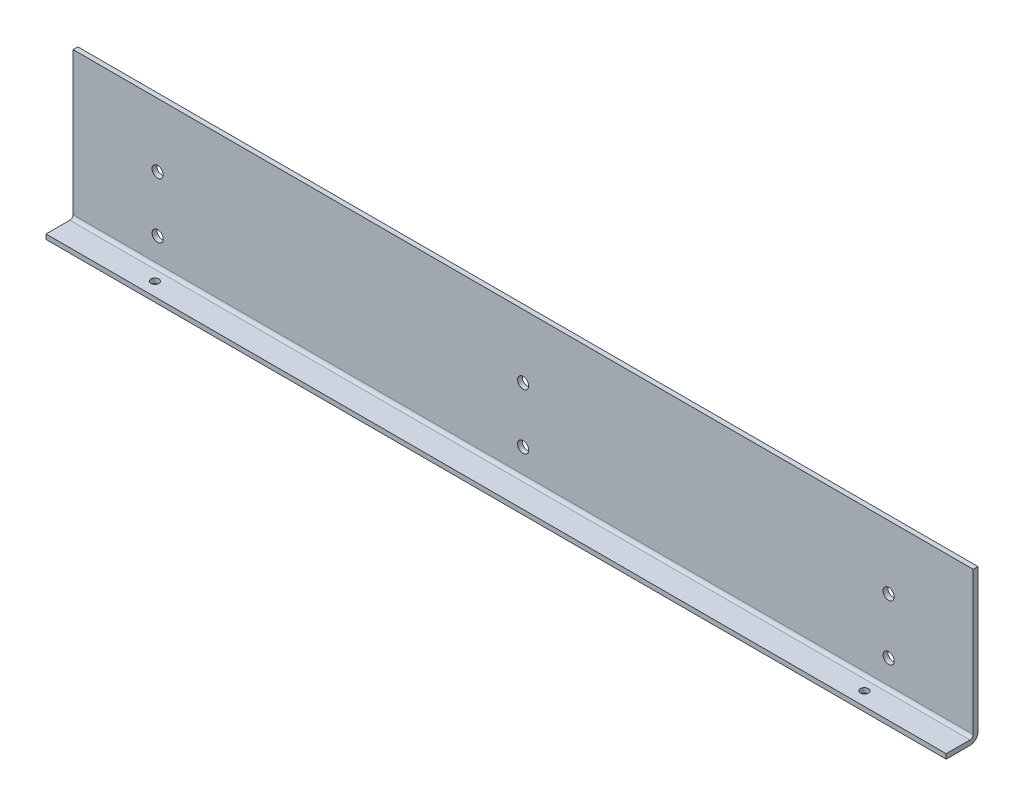
ISO-10303-21;
HEADER;
FILE_DESCRIPTION(('STEP AP214'),'2;1');
FILE_NAME('part.step','',(''),(''),'','','');
FILE_SCHEMA(('AUTOMOTIVE_DESIGN { 1 0 10303 214 1 1 1 1 }'));
ENDSEC;
DATA;
#1=APPLICATION_CONTEXT('core data for automotive mechanical design processes');
#2=APPLICATION_PROTOCOL_DEFINITION('international standard','automotive_design',2000,#1);
#3=PRODUCT_CONTEXT('',#1,'mechanical');
#4=PRODUCT('Part','Part','',(#3));
#5=PRODUCT_RELATED_PRODUCT_CATEGORY('part','',(#4));
#6=PRODUCT_DEFINITION_FORMATION('','',#4);
#7=PRODUCT_DEFINITION_CONTEXT('part definition',#1,'design');
#8=PRODUCT_DEFINITION('design','',#6,#7);
#9=PRODUCT_DEFINITION_SHAPE('','',#8);
#10=(LENGTH_UNIT() NAMED_UNIT(*) SI_UNIT(.MILLI.,.METRE.));
#11=(NAMED_UNIT(*) PLANE_ANGLE_UNIT() SI_UNIT($,.RADIAN.));
#12=(NAMED_UNIT(*) SI_UNIT($,.STERADIAN.) SOLID_ANGLE_UNIT());
#13=UNCERTAINTY_MEASURE_WITH_UNIT(LENGTH_MEASURE(1.E-05),#10,'distance_accuracy_value','');
#14=(GEOMETRIC_REPRESENTATION_CONTEXT(3) GLOBAL_UNCERTAINTY_ASSIGNED_CONTEXT((#13)) GLOBAL_UNIT_ASSIGNED_CONTEXT((#10,
#11,#12)) REPRESENTATION_CONTEXT('',''));
#15=CARTESIAN_POINT('',(0.,0.,0.));
#16=DIRECTION('',(0.,0.,1.));
#17=DIRECTION('',(1.,0.,0.));
#18=AXIS2_PLACEMENT_3D('',#15,#16,#17);
#19=CARTESIAN_POINT('',(0.,0.,3.));
#20=DIRECTION('',(0.,0.,-1.));
#21=DIRECTION('',(-1.,0.,0.));
#22=AXIS2_PLACEMENT_3D('',#19,#20,#21);
#23=PLANE('',#22);
#24=CARTESIAN_POINT('',(513.25,55.,3.));
#25=DIRECTION('',(0.,0.,1.));
#26=DIRECTION('',(1.,0.,0.));
#27=AXIS2_PLACEMENT_3D('',#24,#25,#26);
#28=CIRCLE('',#27,3.50000000000008);
#29=CARTESIAN_POINT('',(516.75,55.,3.));
#30=VERTEX_POINT('',#29);
#31=EDGE_CURVE('E289',#30,#30,#28,.T.);
#32=ORIENTED_EDGE('',*,*,#31,.F.);
#33=EDGE_LOOP('',(#32));
#34=FACE_BOUND('',#33,.T.);
#35=CARTESIAN_POINT('',(283.25,20.,3.));
#36=DIRECTION('',(0.,0.,1.));
#37=DIRECTION('',(1.,0.,0.));
#38=AXIS2_PLACEMENT_3D('',#35,#36,#37);
#39=CIRCLE('',#38,3.50000000000002);
#40=CARTESIAN_POINT('',(286.75,20.,3.));
#41=VERTEX_POINT('',#40);
#42=EDGE_CURVE('E280',#41,#41,#39,.T.);
#43=ORIENTED_EDGE('',*,*,#42,.F.);
#44=EDGE_LOOP('',(#43));
#45=FACE_BOUND('',#44,.T.);
#46=CARTESIAN_POINT('',(283.25,55.,3.));
#47=DIRECTION('',(0.,0.,1.));
#48=DIRECTION('',(1.,0.,0.));
#49=AXIS2_PLACEMENT_3D('',#46,#47,#48);
#50=CIRCLE('',#49,3.50000000000002);
#51=CARTESIAN_POINT('',(286.75,55.,3.));
#52=VERTEX_POINT('',#51);
#53=EDGE_CURVE('E304',#52,#52,#50,.T.);
#54=ORIENTED_EDGE('',*,*,#53,.F.);
#55=EDGE_LOOP('',(#54));
#56=FACE_BOUND('',#55,.T.);
#57=CARTESIAN_POINT('',(53.25,20.,3.));
#58=DIRECTION('',(0.,0.,1.));
#59=DIRECTION('',(1.,0.,0.));
#60=AXIS2_PLACEMENT_3D('',#57,#58,#59);
#61=CIRCLE('',#60,3.50000000000001);
#62=CARTESIAN_POINT('',(56.75,20.,3.));
#63=VERTEX_POINT('',#62);
#64=EDGE_CURVE('E296',#63,#63,#61,.T.);
#65=ORIENTED_EDGE('',*,*,#64,.F.);
#66=EDGE_LOOP('',(#65));
#67=FACE_BOUND('',#66,.T.);
#68=CARTESIAN_POINT('',(513.25,20.,3.));
#69=DIRECTION('',(0.,0.,1.));
#70=DIRECTION('',(1.,0.,0.));
#71=AXIS2_PLACEMENT_3D('',#68,#69,#70);
#72=CIRCLE('',#71,3.50000000000008);
#73=CARTESIAN_POINT('',(516.75,20.,3.));
#74=VERTEX_POINT('',#73);
#75=EDGE_CURVE('E271',#74,#74,#72,.T.);
#76=ORIENTED_EDGE('',*,*,#75,.F.);
#77=EDGE_LOOP('',(#76));
#78=FACE_BOUND('',#77,.T.);
#79=CARTESIAN_POINT('',(53.25,55.,3.));
#80=DIRECTION('',(0.,0.,1.));
#81=DIRECTION('',(1.,0.,0.));
#82=AXIS2_PLACEMENT_3D('',#79,#80,#81);
#83=CIRCLE('',#82,3.50000000000001);
#84=CARTESIAN_POINT('',(56.75,55.,3.));
#85=VERTEX_POINT('',#84);
#86=EDGE_CURVE('E142',#85,#85,#83,.T.);
#87=ORIENTED_EDGE('',*,*,#86,.F.);
#88=EDGE_LOOP('',(#87));
#89=FACE_BOUND('',#88,.T.);
#90=DIRECTION('',(0.,-1.,0.));
#91=VECTOR('',#90,1.);
#92=CARTESIAN_POINT('',(0.,0.,3.));
#93=LINE('',#92,#91);
#94=CARTESIAN_POINT('',(0.,95.,3.));
#95=VERTEX_POINT('',#94);
#96=CARTESIAN_POINT('',(0.,5.,3.));
#97=VERTEX_POINT('',#96);
#98=EDGE_CURVE('E158',#95,#97,#93,.T.);
#99=ORIENTED_EDGE('',*,*,#98,.T.);
#100=DIRECTION('',(-1.,0.,0.));
#101=VECTOR('',#100,1.);
#102=CARTESIAN_POINT('',(566.5,5.,3.));
#103=LINE('',#102,#101);
#104=CARTESIAN_POINT('',(566.5,5.,3.));
#105=VERTEX_POINT('',#104);
#106=EDGE_CURVE('E67',#97,#105,#103,.F.);
#107=ORIENTED_EDGE('',*,*,#106,.T.);
#108=DIRECTION('',(0.,1.,0.));
#109=VECTOR('',#108,1.);
#110=CARTESIAN_POINT('',(566.5,0.,3.));
#111=LINE('',#110,#109);
#112=CARTESIAN_POINT('',(566.5,95.,3.));
#113=VERTEX_POINT('',#112);
#114=EDGE_CURVE('E161',#105,#113,#111,.T.);
#115=ORIENTED_EDGE('',*,*,#114,.T.);
#116=DIRECTION('',(-1.,0.,0.));
#117=VECTOR('',#116,1.);
#118=CARTESIAN_POINT('',(0.,95.,3.));
#119=LINE('',#118,#117);
#120=EDGE_CURVE('E165',#113,#95,#119,.T.);
#121=ORIENTED_EDGE('',*,*,#120,.T.);
#122=EDGE_LOOP('',(#99,#107,#115,#121));
#123=FACE_BOUND('',#122,.T.);
#124=ADVANCED_FACE('F45',(#34,#45,#56,#67,#78,#89,#123),#23,.F.);
#125=CARTESIAN_POINT('',(0.,0.,3.));
#126=DIRECTION('',(1.,0.,0.));
#127=DIRECTION('',(0.,0.,-1.));
#128=AXIS2_PLACEMENT_3D('',#125,#126,#127);
#129=PLANE('',#128);
#130=DIRECTION('',(0.,-1.,0.));
#131=VECTOR('',#130,1.);
#132=CARTESIAN_POINT('',(0.,0.,0.));
#133=LINE('',#132,#131);
#134=CARTESIAN_POINT('',(0.,95.,0.));
#135=VERTEX_POINT('',#134);
#136=CARTESIAN_POINT('',(0.,5.,0.));
#137=VERTEX_POINT('',#136);
#138=EDGE_CURVE('E157',#135,#137,#133,.T.);
#139=ORIENTED_EDGE('',*,*,#138,.T.);
#140=CARTESIAN_POINT('',(0.,5.,5.));
#141=DIRECTION('',(1.,0.,0.));
#142=DIRECTION('',(0.,0.,-1.));
#143=AXIS2_PLACEMENT_3D('',#140,#141,#142);
#144=CIRCLE('',#143,5.);
#145=CARTESIAN_POINT('',(0.,0.,5.));
#146=VERTEX_POINT('',#145);
#147=EDGE_CURVE('E116',#137,#146,#144,.F.);
#148=ORIENTED_EDGE('',*,*,#147,.T.);
#149=DIRECTION('',(0.,0.,-1.));
#150=VECTOR('',#149,1.);
#151=CARTESIAN_POINT('',(0.,0.,3.));
#152=LINE('',#151,#150);
#153=CARTESIAN_POINT('',(0.,0.,20.));
#154=VERTEX_POINT('',#153);
#155=EDGE_CURVE('E109',#154,#146,#152,.T.);
#156=ORIENTED_EDGE('',*,*,#155,.F.);
#157=DIRECTION('',(0.,-1.,0.));
#158=VECTOR('',#157,1.);
#159=CARTESIAN_POINT('',(0.,0.,20.));
#160=LINE('',#159,#158);
#161=CARTESIAN_POINT('',(0.,3.,20.));
#162=VERTEX_POINT('',#161);
#163=EDGE_CURVE('E114',#162,#154,#160,.T.);
#164=ORIENTED_EDGE('',*,*,#163,.F.);
#165=DIRECTION('',(0.,0.,-1.));
#166=VECTOR('',#165,1.);
#167=CARTESIAN_POINT('',(0.,3.,20.));
#168=LINE('',#167,#166);
#169=CARTESIAN_POINT('',(0.,3.,5.));
#170=VERTEX_POINT('',#169);
#171=EDGE_CURVE('E150',#162,#170,#168,.T.);
#172=ORIENTED_EDGE('',*,*,#171,.T.);
#173=CARTESIAN_POINT('',(0.,5.,5.));
#174=DIRECTION('',(1.,0.,0.));
#175=DIRECTION('',(0.,0.,-1.));
#176=AXIS2_PLACEMENT_3D('',#173,#174,#175);
#177=CIRCLE('',#176,2.);
#178=EDGE_CURVE('E54',#170,#97,#177,.T.);
#179=ORIENTED_EDGE('',*,*,#178,.T.);
#180=ORIENTED_EDGE('',*,*,#98,.F.);
#181=DIRECTION('',(0.,0.,-1.));
#182=VECTOR('',#181,1.);
#183=CARTESIAN_POINT('',(0.,95.,3.));
#184=LINE('',#183,#182);
#185=EDGE_CURVE('E168',#95,#135,#184,.T.);
#186=ORIENTED_EDGE('',*,*,#185,.T.);
#187=EDGE_LOOP('',(#139,#148,#156,#164,#172,#179,#180,#186));
#188=FACE_BOUND('',#187,.T.);
#189=ADVANCED_FACE('F112',(#188),#129,.F.);
#190=CARTESIAN_POINT('',(0.,0.,3.));
#191=DIRECTION('',(0.,1.,0.));
#192=DIRECTION('',(0.,0.,1.));
#193=AXIS2_PLACEMENT_3D('',#190,#191,#192);
#194=PLANE('',#193);
#195=CARTESIAN_POINT('',(60.0000000000001,0.,11.5));
#196=DIRECTION('',(0.,1.,0.));
#197=DIRECTION('',(0.,0.,1.));
#198=AXIS2_PLACEMENT_3D('',#195,#196,#197);
#199=CIRCLE('',#198,2.5);
#200=CARTESIAN_POINT('',(60.0000000000001,0.,14.));
#201=VERTEX_POINT('',#200);
#202=EDGE_CURVE('E257',#201,#201,#199,.T.);
#203=ORIENTED_EDGE('',*,*,#202,.T.);
#204=EDGE_LOOP('',(#203));
#205=FACE_BOUND('',#204,.T.);
#206=CARTESIAN_POINT('',(506.5,0.,11.5));
#207=DIRECTION('',(0.,1.,0.));
#208=DIRECTION('',(0.,0.,1.));
#209=AXIS2_PLACEMENT_3D('',#206,#207,#208);
#210=CIRCLE('',#209,2.50000000000003);
#211=CARTESIAN_POINT('',(506.5,0.,14.));
#212=VERTEX_POINT('',#211);
#213=EDGE_CURVE('E260',#212,#212,#210,.T.);
#214=ORIENTED_EDGE('',*,*,#213,.T.);
#215=EDGE_LOOP('',(#214));
#216=FACE_BOUND('',#215,.T.);
#217=ORIENTED_EDGE('',*,*,#155,.T.);
#218=DIRECTION('',(1.,0.,0.));
#219=VECTOR('',#218,1.);
#220=CARTESIAN_POINT('',(566.5,0.,5.));
#221=LINE('',#220,#219);
#222=CARTESIAN_POINT('',(566.5,0.,5.));
#223=VERTEX_POINT('',#222);
#224=EDGE_CURVE('E121',#146,#223,#221,.T.);
#225=ORIENTED_EDGE('',*,*,#224,.T.);
#226=DIRECTION('',(0.,0.,-1.));
#227=VECTOR('',#226,1.);
#228=CARTESIAN_POINT('',(566.5,0.,3.));
#229=LINE('',#228,#227);
#230=CARTESIAN_POINT('',(566.5,0.,20.));
#231=VERTEX_POINT('',#230);
#232=EDGE_CURVE('E122',#231,#223,#229,.T.);
#233=ORIENTED_EDGE('',*,*,#232,.F.);
#234=DIRECTION('',(1.,0.,0.));
#235=VECTOR('',#234,1.);
#236=CARTESIAN_POINT('',(0.,0.,20.));
#237=LINE('',#236,#235);
#238=EDGE_CURVE('E125',#154,#231,#237,.T.);
#239=ORIENTED_EDGE('',*,*,#238,.F.);
#240=EDGE_LOOP('',(#217,#225,#233,#239));
#241=FACE_BOUND('',#240,.T.);
#242=ADVANCED_FACE('F126',(#205,#216,#241),#194,.F.);
#243=CARTESIAN_POINT('',(566.5,0.,3.));
#244=DIRECTION('',(-1.,0.,0.));
#245=DIRECTION('',(0.,0.,1.));
#246=AXIS2_PLACEMENT_3D('',#243,#244,#245);
#247=PLANE('',#246);
#248=ORIENTED_EDGE('',*,*,#232,.T.);
#249=CARTESIAN_POINT('',(566.5,5.,5.));
#250=DIRECTION('',(-1.,0.,0.));
#251=DIRECTION('',(0.,0.,1.));
#252=AXIS2_PLACEMENT_3D('',#249,#250,#251);
#253=CIRCLE('',#252,5.);
#254=CARTESIAN_POINT('',(566.5,5.,0.));
#255=VERTEX_POINT('',#254);
#256=EDGE_CURVE('E187',#223,#255,#253,.F.);
#257=ORIENTED_EDGE('',*,*,#256,.T.);
#258=DIRECTION('',(0.,1.,0.));
#259=VECTOR('',#258,1.);
#260=CARTESIAN_POINT('',(566.5,0.,0.));
#261=LINE('',#260,#259);
#262=CARTESIAN_POINT('',(566.5,95.,0.));
#263=VERTEX_POINT('',#262);
#264=EDGE_CURVE('E171',#255,#263,#261,.T.);
#265=ORIENTED_EDGE('',*,*,#264,.T.);
#266=DIRECTION('',(0.,0.,-1.));
#267=VECTOR('',#266,1.);
#268=CARTESIAN_POINT('',(566.5,95.,3.));
#269=LINE('',#268,#267);
#270=EDGE_CURVE('E179',#113,#263,#269,.T.);
#271=ORIENTED_EDGE('',*,*,#270,.F.);
#272=ORIENTED_EDGE('',*,*,#114,.F.);
#273=CARTESIAN_POINT('',(566.5,5.,5.));
#274=DIRECTION('',(-1.,0.,0.));
#275=DIRECTION('',(0.,0.,1.));
#276=AXIS2_PLACEMENT_3D('',#273,#274,#275);
#277=CIRCLE('',#276,2.);
#278=CARTESIAN_POINT('',(566.5,3.,5.));
#279=VERTEX_POINT('',#278);
#280=EDGE_CURVE('E11',#105,#279,#277,.T.);
#281=ORIENTED_EDGE('',*,*,#280,.T.);
#282=DIRECTION('',(0.,0.,-1.));
#283=VECTOR('',#282,1.);
#284=CARTESIAN_POINT('',(566.5,3.,20.));
#285=LINE('',#284,#283);
#286=CARTESIAN_POINT('',(566.5,3.,20.));
#287=VERTEX_POINT('',#286);
#288=EDGE_CURVE('E153',#287,#279,#285,.T.);
#289=ORIENTED_EDGE('',*,*,#288,.F.);
#290=DIRECTION('',(0.,1.,0.));
#291=VECTOR('',#290,1.);
#292=CARTESIAN_POINT('',(566.5,0.,20.));
#293=LINE('',#292,#291);
#294=EDGE_CURVE('E131',#231,#287,#293,.T.);
#295=ORIENTED_EDGE('',*,*,#294,.F.);
#296=EDGE_LOOP('',(#248,#257,#265,#271,#272,#281,#289,#295));
#297=FACE_BOUND('',#296,.T.);
#298=ADVANCED_FACE('F208',(#297),#247,.F.);
#299=CARTESIAN_POINT('',(0.,95.,3.));
#300=DIRECTION('',(0.,-1.,0.));
#301=DIRECTION('',(0.,0.,-1.));
#302=AXIS2_PLACEMENT_3D('',#299,#300,#301);
#303=PLANE('',#302);
#304=DIRECTION('',(-1.,0.,0.));
#305=VECTOR('',#304,1.);
#306=CARTESIAN_POINT('',(0.,95.,0.));
#307=LINE('',#306,#305);
#308=EDGE_CURVE('E162',#263,#135,#307,.T.);
#309=ORIENTED_EDGE('',*,*,#308,.T.);
#310=ORIENTED_EDGE('',*,*,#185,.F.);
#311=ORIENTED_EDGE('',*,*,#120,.F.);
#312=ORIENTED_EDGE('',*,*,#270,.T.);
#313=EDGE_LOOP('',(#309,#310,#311,#312));
#314=FACE_BOUND('',#313,.T.);
#315=ADVANCED_FACE('F213',(#314),#303,.F.);
#316=CARTESIAN_POINT('',(0.,0.,0.));
#317=DIRECTION('',(0.,0.,-1.));
#318=DIRECTION('',(-1.,0.,0.));
#319=AXIS2_PLACEMENT_3D('',#316,#317,#318);
#320=PLANE('',#319);
#321=CARTESIAN_POINT('',(513.25,55.,0.));
#322=DIRECTION('',(0.,0.,1.));
#323=DIRECTION('',(1.,0.,0.));
#324=AXIS2_PLACEMENT_3D('',#321,#322,#323);
#325=CIRCLE('',#324,3.50000000000008);
#326=CARTESIAN_POINT('',(516.75,55.,0.));
#327=VERTEX_POINT('',#326);
#328=EDGE_CURVE('E275',#327,#327,#325,.T.);
#329=ORIENTED_EDGE('',*,*,#328,.T.);
#330=EDGE_LOOP('',(#329));
#331=FACE_BOUND('',#330,.T.);
#332=CARTESIAN_POINT('',(283.25,20.,0.));
#333=DIRECTION('',(0.,0.,1.));
#334=DIRECTION('',(1.,0.,0.));
#335=AXIS2_PLACEMENT_3D('',#332,#333,#334);
#336=CIRCLE('',#335,3.50000000000002);
#337=CARTESIAN_POINT('',(286.75,20.,0.));
#338=VERTEX_POINT('',#337);
#339=EDGE_CURVE('E285',#338,#338,#336,.T.);
#340=ORIENTED_EDGE('',*,*,#339,.T.);
#341=EDGE_LOOP('',(#340));
#342=FACE_BOUND('',#341,.T.);
#343=CARTESIAN_POINT('',(283.25,55.,0.));
#344=DIRECTION('',(0.,0.,1.));
#345=DIRECTION('',(1.,0.,0.));
#346=AXIS2_PLACEMENT_3D('',#343,#344,#345);
#347=CIRCLE('',#346,3.50000000000002);
#348=CARTESIAN_POINT('',(286.75,55.,0.));
#349=VERTEX_POINT('',#348);
#350=EDGE_CURVE('E284',#349,#349,#347,.T.);
#351=ORIENTED_EDGE('',*,*,#350,.T.);
#352=EDGE_LOOP('',(#351));
#353=FACE_BOUND('',#352,.T.);
#354=CARTESIAN_POINT('',(53.25,20.,0.));
#355=DIRECTION('',(0.,0.,1.));
#356=DIRECTION('',(1.,0.,0.));
#357=AXIS2_PLACEMENT_3D('',#354,#355,#356);
#358=CIRCLE('',#357,3.50000000000001);
#359=CARTESIAN_POINT('',(56.75,20.,0.));
#360=VERTEX_POINT('',#359);
#361=EDGE_CURVE('E300',#360,#360,#358,.T.);
#362=ORIENTED_EDGE('',*,*,#361,.T.);
#363=EDGE_LOOP('',(#362));
#364=FACE_BOUND('',#363,.T.);
#365=CARTESIAN_POINT('',(513.25,20.,0.));
#366=DIRECTION('',(0.,0.,1.));
#367=DIRECTION('',(1.,0.,0.));
#368=AXIS2_PLACEMENT_3D('',#365,#366,#367);
#369=CIRCLE('',#368,3.50000000000008);
#370=CARTESIAN_POINT('',(516.75,20.,0.));
#371=VERTEX_POINT('',#370);
#372=EDGE_CURVE('E276',#371,#371,#369,.T.);
#373=ORIENTED_EDGE('',*,*,#372,.T.);
#374=EDGE_LOOP('',(#373));
#375=FACE_BOUND('',#374,.T.);
#376=CARTESIAN_POINT('',(53.25,55.,0.));
#377=DIRECTION('',(0.,0.,1.));
#378=DIRECTION('',(1.,0.,0.));
#379=AXIS2_PLACEMENT_3D('',#376,#377,#378);
#380=CIRCLE('',#379,3.50000000000001);
#381=CARTESIAN_POINT('',(56.75,55.,0.));
#382=VERTEX_POINT('',#381);
#383=EDGE_CURVE('E138',#382,#382,#380,.T.);
#384=ORIENTED_EDGE('',*,*,#383,.T.);
#385=EDGE_LOOP('',(#384));
#386=FACE_BOUND('',#385,.T.);
#387=ORIENTED_EDGE('',*,*,#264,.F.);
#388=DIRECTION('',(1.,0.,0.));
#389=VECTOR('',#388,1.);
#390=CARTESIAN_POINT('',(0.,5.,0.));
#391=LINE('',#390,#389);
#392=EDGE_CURVE('E190',#255,#137,#391,.F.);
#393=ORIENTED_EDGE('',*,*,#392,.T.);
#394=ORIENTED_EDGE('',*,*,#138,.F.);
#395=ORIENTED_EDGE('',*,*,#308,.F.);
#396=EDGE_LOOP('',(#387,#393,#394,#395));
#397=FACE_BOUND('',#396,.T.);
#398=ADVANCED_FACE('F218',(#331,#342,#353,#364,#375,#386,#397),#320,.T.);
#399=CARTESIAN_POINT('',(0.,3.,20.));
#400=DIRECTION('',(0.,-1.,0.));
#401=DIRECTION('',(0.,0.,-1.));
#402=AXIS2_PLACEMENT_3D('',#399,#400,#401);
#403=PLANE('',#402);
#404=CARTESIAN_POINT('',(60.0000000000001,3.,11.5));
#405=DIRECTION('',(0.,1.,0.));
#406=DIRECTION('',(0.,0.,1.));
#407=AXIS2_PLACEMENT_3D('',#404,#405,#406);
#408=CIRCLE('',#407,2.5);
#409=CARTESIAN_POINT('',(60.0000000000001,3.,14.));
#410=VERTEX_POINT('',#409);
#411=EDGE_CURVE('E267',#410,#410,#408,.T.);
#412=ORIENTED_EDGE('',*,*,#411,.F.);
#413=EDGE_LOOP('',(#412));
#414=FACE_BOUND('',#413,.T.);
#415=CARTESIAN_POINT('',(506.5,3.,11.5));
#416=DIRECTION('',(0.,1.,0.));
#417=DIRECTION('',(0.,0.,1.));
#418=AXIS2_PLACEMENT_3D('',#415,#416,#417);
#419=CIRCLE('',#418,2.50000000000003);
#420=CARTESIAN_POINT('',(506.5,3.,14.));
#421=VERTEX_POINT('',#420);
#422=EDGE_CURVE('E263',#421,#421,#419,.T.);
#423=ORIENTED_EDGE('',*,*,#422,.F.);
#424=EDGE_LOOP('',(#423));
#425=FACE_BOUND('',#424,.T.);
#426=ORIENTED_EDGE('',*,*,#288,.T.);
#427=DIRECTION('',(-1.,0.,0.));
#428=VECTOR('',#427,1.);
#429=CARTESIAN_POINT('',(0.,3.,5.));
#430=LINE('',#429,#428);
#431=EDGE_CURVE('E195',#279,#170,#430,.T.);
#432=ORIENTED_EDGE('',*,*,#431,.T.);
#433=ORIENTED_EDGE('',*,*,#171,.F.);
#434=DIRECTION('',(-1.,0.,0.));
#435=VECTOR('',#434,1.);
#436=CARTESIAN_POINT('',(0.,3.,20.));
#437=LINE('',#436,#435);
#438=EDGE_CURVE('E135',#287,#162,#437,.T.);
#439=ORIENTED_EDGE('',*,*,#438,.F.);
#440=EDGE_LOOP('',(#426,#432,#433,#439));
#441=FACE_BOUND('',#440,.T.);
#442=ADVANCED_FACE('F203',(#414,#425,#441),#403,.F.);
#443=CARTESIAN_POINT('',(0.,0.,20.));
#444=DIRECTION('',(0.,0.,-1.));
#445=DIRECTION('',(-1.,0.,0.));
#446=AXIS2_PLACEMENT_3D('',#443,#444,#445);
#447=PLANE('',#446);
#448=ORIENTED_EDGE('',*,*,#163,.T.);
#449=ORIENTED_EDGE('',*,*,#238,.T.);
#450=ORIENTED_EDGE('',*,*,#294,.T.);
#451=ORIENTED_EDGE('',*,*,#438,.T.);
#452=EDGE_LOOP('',(#448,#449,#450,#451));
#453=FACE_BOUND('',#452,.T.);
#454=ADVANCED_FACE('F133',(#453),#447,.F.);
#455=CARTESIAN_POINT('',(53.25,55.,0.));
#456=DIRECTION('',(0.,0.,1.));
#457=DIRECTION('',(1.,0.,0.));
#458=AXIS2_PLACEMENT_3D('',#455,#456,#457);
#459=CYLINDRICAL_SURFACE('',#458,3.50000000000001);
#460=ORIENTED_EDGE('',*,*,#383,.F.);
#461=EDGE_LOOP('',(#460));
#462=FACE_BOUND('',#461,.T.);
#463=ORIENTED_EDGE('',*,*,#86,.T.);
#464=EDGE_LOOP('',(#463));
#465=FACE_BOUND('',#464,.T.);
#466=ADVANCED_FACE('F331',(#462,#465),#459,.F.);
#467=CARTESIAN_POINT('',(513.25,20.,0.));
#468=DIRECTION('',(0.,0.,1.));
#469=DIRECTION('',(1.,0.,0.));
#470=AXIS2_PLACEMENT_3D('',#467,#468,#469);
#471=CYLINDRICAL_SURFACE('',#470,3.50000000000008);
#472=ORIENTED_EDGE('',*,*,#372,.F.);
#473=EDGE_LOOP('',(#472));
#474=FACE_BOUND('',#473,.T.);
#475=ORIENTED_EDGE('',*,*,#75,.T.);
#476=EDGE_LOOP('',(#475));
#477=FACE_BOUND('',#476,.T.);
#478=ADVANCED_FACE('F333',(#474,#477),#471,.F.);
#479=CARTESIAN_POINT('',(53.25,20.,0.));
#480=DIRECTION('',(0.,0.,1.));
#481=DIRECTION('',(1.,0.,0.));
#482=AXIS2_PLACEMENT_3D('',#479,#480,#481);
#483=CYLINDRICAL_SURFACE('',#482,3.50000000000001);
#484=ORIENTED_EDGE('',*,*,#361,.F.);
#485=EDGE_LOOP('',(#484));
#486=FACE_BOUND('',#485,.T.);
#487=ORIENTED_EDGE('',*,*,#64,.T.);
#488=EDGE_LOOP('',(#487));
#489=FACE_BOUND('',#488,.T.);
#490=ADVANCED_FACE('F318',(#486,#489),#483,.F.);
#491=CARTESIAN_POINT('',(283.25,55.,0.));
#492=DIRECTION('',(0.,0.,1.));
#493=DIRECTION('',(1.,0.,0.));
#494=AXIS2_PLACEMENT_3D('',#491,#492,#493);
#495=CYLINDRICAL_SURFACE('',#494,3.50000000000002);
#496=ORIENTED_EDGE('',*,*,#350,.F.);
#497=EDGE_LOOP('',(#496));
#498=FACE_BOUND('',#497,.T.);
#499=ORIENTED_EDGE('',*,*,#53,.T.);
#500=EDGE_LOOP('',(#499));
#501=FACE_BOUND('',#500,.T.);
#502=ADVANCED_FACE('F314',(#498,#501),#495,.F.);
#503=CARTESIAN_POINT('',(283.25,20.,0.));
#504=DIRECTION('',(0.,0.,1.));
#505=DIRECTION('',(1.,0.,0.));
#506=AXIS2_PLACEMENT_3D('',#503,#504,#505);
#507=CYLINDRICAL_SURFACE('',#506,3.50000000000002);
#508=ORIENTED_EDGE('',*,*,#339,.F.);
#509=EDGE_LOOP('',(#508));
#510=FACE_BOUND('',#509,.T.);
#511=ORIENTED_EDGE('',*,*,#42,.T.);
#512=EDGE_LOOP('',(#511));
#513=FACE_BOUND('',#512,.T.);
#514=ADVANCED_FACE('F317',(#510,#513),#507,.F.);
#515=CARTESIAN_POINT('',(513.25,55.,0.));
#516=DIRECTION('',(0.,0.,1.));
#517=DIRECTION('',(1.,0.,0.));
#518=AXIS2_PLACEMENT_3D('',#515,#516,#517);
#519=CYLINDRICAL_SURFACE('',#518,3.50000000000008);
#520=ORIENTED_EDGE('',*,*,#328,.F.);
#521=EDGE_LOOP('',(#520));
#522=FACE_BOUND('',#521,.T.);
#523=ORIENTED_EDGE('',*,*,#31,.T.);
#524=EDGE_LOOP('',(#523));
#525=FACE_BOUND('',#524,.T.);
#526=ADVANCED_FACE('F347',(#522,#525),#519,.F.);
#527=CARTESIAN_POINT('',(506.5,0.,11.5));
#528=DIRECTION('',(0.,1.,0.));
#529=DIRECTION('',(0.,0.,1.));
#530=AXIS2_PLACEMENT_3D('',#527,#528,#529);
#531=CYLINDRICAL_SURFACE('',#530,2.50000000000003);
#532=ORIENTED_EDGE('',*,*,#213,.F.);
#533=EDGE_LOOP('',(#532));
#534=FACE_BOUND('',#533,.T.);
#535=ORIENTED_EDGE('',*,*,#422,.T.);
#536=EDGE_LOOP('',(#535));
#537=FACE_BOUND('',#536,.T.);
#538=ADVANCED_FACE('F230',(#534,#537),#531,.F.);
#539=CARTESIAN_POINT('',(60.0000000000001,0.,11.5));
#540=DIRECTION('',(0.,1.,0.));
#541=DIRECTION('',(0.,0.,1.));
#542=AXIS2_PLACEMENT_3D('',#539,#540,#541);
#543=CYLINDRICAL_SURFACE('',#542,2.5);
#544=ORIENTED_EDGE('',*,*,#202,.F.);
#545=EDGE_LOOP('',(#544));
#546=FACE_BOUND('',#545,.T.);
#547=ORIENTED_EDGE('',*,*,#411,.T.);
#548=EDGE_LOOP('',(#547));
#549=FACE_BOUND('',#548,.T.);
#550=ADVANCED_FACE('F223',(#546,#549),#543,.F.);
#551=CARTESIAN_POINT('',(0.,5.,5.));
#552=DIRECTION('',(-1.,0.,0.));
#553=DIRECTION('',(0.,0.,1.));
#554=AXIS2_PLACEMENT_3D('',#551,#552,#553);
#555=CYLINDRICAL_SURFACE('',#554,5.);
#556=ORIENTED_EDGE('',*,*,#147,.F.);
#557=ORIENTED_EDGE('',*,*,#392,.F.);
#558=ORIENTED_EDGE('',*,*,#256,.F.);
#559=ORIENTED_EDGE('',*,*,#224,.F.);
#560=EDGE_LOOP('',(#556,#557,#558,#559));
#561=FACE_BOUND('',#560,.T.);
#562=ADVANCED_FACE('F221',(#561),#555,.T.);
#563=CARTESIAN_POINT('',(0.,5.,5.));
#564=DIRECTION('',(1.,0.,0.));
#565=DIRECTION('',(0.,0.,-1.));
#566=AXIS2_PLACEMENT_3D('',#563,#564,#565);
#567=CYLINDRICAL_SURFACE('',#566,2.);
#568=ORIENTED_EDGE('',*,*,#280,.F.);
#569=ORIENTED_EDGE('',*,*,#106,.F.);
#570=ORIENTED_EDGE('',*,*,#178,.F.);
#571=ORIENTED_EDGE('',*,*,#431,.F.);
#572=EDGE_LOOP('',(#568,#569,#570,#571));
#573=FACE_BOUND('',#572,.T.);
#574=ADVANCED_FACE('F47',(#573),#567,.F.);
#575=CLOSED_SHELL('',(#124,#189,#242,#298,#315,#398,#442,#454,#466,#478,#490,#502,#514,#526,
#538,#550,#562,#574));
#576=MANIFOLD_SOLID_BREP('B2',#575);
#577=ADVANCED_BREP_SHAPE_REPRESENTATION('',(#18,#576),#14);
#578=SHAPE_DEFINITION_REPRESENTATION(#9,#577);
ENDSEC;
END-ISO-10303-21;
